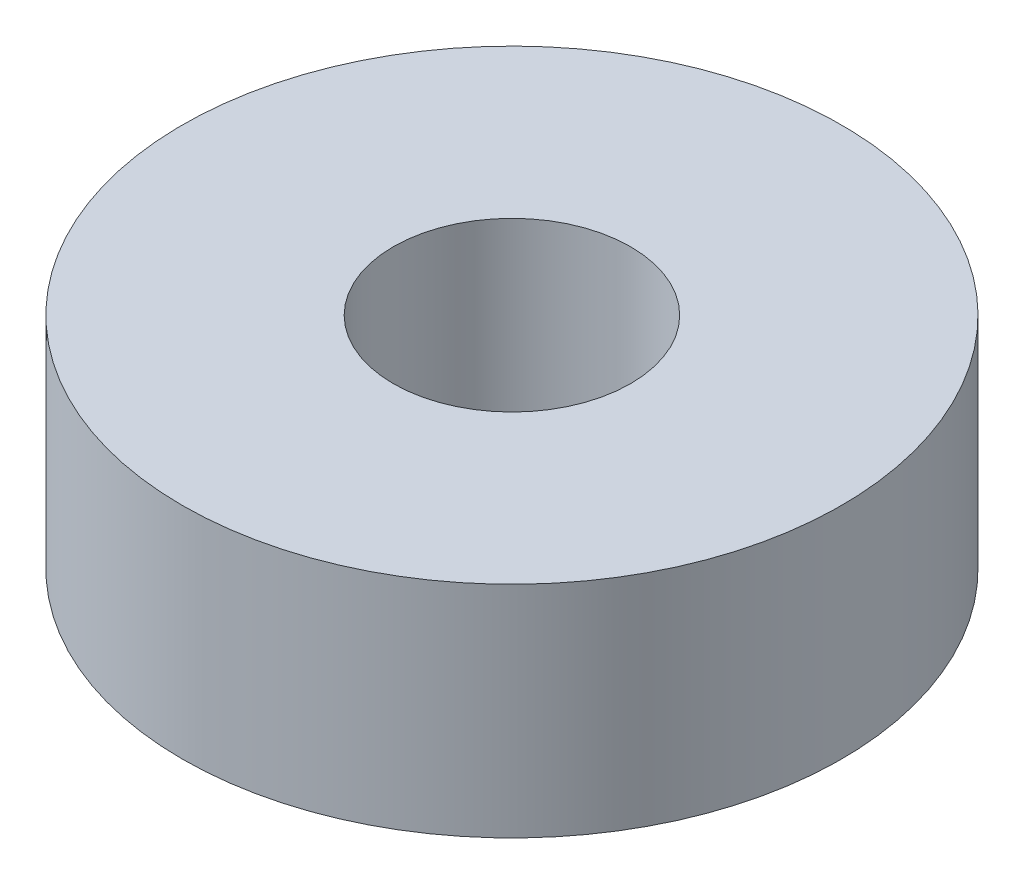
ISO-10303-21;
HEADER;
FILE_DESCRIPTION(('STEP AP214'),'2;1');
FILE_NAME('part.step','',(''),(''),'','','');
FILE_SCHEMA(('AUTOMOTIVE_DESIGN { 1 0 10303 214 1 1 1 1 }'));
ENDSEC;
DATA;
#1=APPLICATION_CONTEXT('core data for automotive mechanical design processes');
#2=APPLICATION_PROTOCOL_DEFINITION('international standard','automotive_design',2000,#1);
#3=PRODUCT_CONTEXT('',#1,'mechanical');
#4=PRODUCT('Part','Part','',(#3));
#5=PRODUCT_RELATED_PRODUCT_CATEGORY('part','',(#4));
#6=PRODUCT_DEFINITION_FORMATION('','',#4);
#7=PRODUCT_DEFINITION_CONTEXT('part definition',#1,'design');
#8=PRODUCT_DEFINITION('design','',#6,#7);
#9=PRODUCT_DEFINITION_SHAPE('','',#8);
#10=(LENGTH_UNIT() NAMED_UNIT(*) SI_UNIT(.MILLI.,.METRE.));
#11=(NAMED_UNIT(*) PLANE_ANGLE_UNIT() SI_UNIT($,.RADIAN.));
#12=(NAMED_UNIT(*) SI_UNIT($,.STERADIAN.) SOLID_ANGLE_UNIT());
#13=UNCERTAINTY_MEASURE_WITH_UNIT(LENGTH_MEASURE(1.E-05),#10,'distance_accuracy_value','');
#14=(GEOMETRIC_REPRESENTATION_CONTEXT(3) GLOBAL_UNCERTAINTY_ASSIGNED_CONTEXT((#13)) GLOBAL_UNIT_ASSIGNED_CONTEXT((#10,
#11,#12)) REPRESENTATION_CONTEXT('',''));
#15=CARTESIAN_POINT('',(0.,0.,0.));
#16=DIRECTION('',(0.,0.,1.));
#17=DIRECTION('',(1.,0.,0.));
#18=AXIS2_PLACEMENT_3D('',#15,#16,#17);
#19=CARTESIAN_POINT('',(0.,5.,0.));
#20=DIRECTION('',(0.,1.,0.));
#21=DIRECTION('',(0.,0.,1.));
#22=AXIS2_PLACEMENT_3D('',#19,#20,#21);
#23=PLANE('',#22);
#24=CARTESIAN_POINT('',(0.,5.,0.));
#25=DIRECTION('',(0.,1.,0.));
#26=DIRECTION('',(0.,0.,1.));
#27=AXIS2_PLACEMENT_3D('',#24,#25,#26);
#28=CIRCLE('',#27,7.5);
#29=CARTESIAN_POINT('',(0.,5.,7.5));
#30=VERTEX_POINT('',#29);
#31=EDGE_CURVE('E10',#30,#30,#28,.T.);
#32=ORIENTED_EDGE('',*,*,#31,.T.);
#33=EDGE_LOOP('',(#32));
#34=FACE_BOUND('',#33,.T.);
#35=CARTESIAN_POINT('',(0.,5.,0.));
#36=DIRECTION('',(0.,1.,0.));
#37=DIRECTION('',(0.,0.,1.));
#38=AXIS2_PLACEMENT_3D('',#35,#36,#37);
#39=CIRCLE('',#38,2.7);
#40=CARTESIAN_POINT('',(0.,5.,2.7));
#41=VERTEX_POINT('',#40);
#42=EDGE_CURVE('E50',#41,#41,#39,.T.);
#43=ORIENTED_EDGE('',*,*,#42,.F.);
#44=EDGE_LOOP('',(#43));
#45=FACE_BOUND('',#44,.T.);
#46=ADVANCED_FACE('F37',(#34,#45),#23,.T.);
#47=CARTESIAN_POINT('',(0.,0.,0.));
#48=DIRECTION('',(0.,1.,0.));
#49=DIRECTION('',(0.,0.,1.));
#50=AXIS2_PLACEMENT_3D('',#47,#48,#49);
#51=PLANE('',#50);
#52=CARTESIAN_POINT('',(0.,0.,0.));
#53=DIRECTION('',(0.,1.,0.));
#54=DIRECTION('',(0.,0.,1.));
#55=AXIS2_PLACEMENT_3D('',#52,#53,#54);
#56=CIRCLE('',#55,7.5);
#57=CARTESIAN_POINT('',(0.,0.,7.5));
#58=VERTEX_POINT('',#57);
#59=EDGE_CURVE('E41',#58,#58,#56,.T.);
#60=ORIENTED_EDGE('',*,*,#59,.F.);
#61=EDGE_LOOP('',(#60));
#62=FACE_BOUND('',#61,.T.);
#63=CARTESIAN_POINT('',(0.,0.,0.));
#64=DIRECTION('',(0.,1.,0.));
#65=DIRECTION('',(0.,0.,1.));
#66=AXIS2_PLACEMENT_3D('',#63,#64,#65);
#67=CIRCLE('',#66,2.7);
#68=CARTESIAN_POINT('',(0.,0.,2.7));
#69=VERTEX_POINT('',#68);
#70=EDGE_CURVE('E52',#69,#69,#67,.T.);
#71=ORIENTED_EDGE('',*,*,#70,.T.);
#72=EDGE_LOOP('',(#71));
#73=FACE_BOUND('',#72,.T.);
#74=ADVANCED_FACE('F64',(#62,#73),#51,.F.);
#75=CARTESIAN_POINT('',(0.,5.,0.));
#76=DIRECTION('',(0.,-1.,0.));
#77=DIRECTION('',(0.,0.,-1.));
#78=AXIS2_PLACEMENT_3D('',#75,#76,#77);
#79=CYLINDRICAL_SURFACE('',#78,7.5);
#80=ORIENTED_EDGE('',*,*,#31,.F.);
#81=EDGE_LOOP('',(#80));
#82=FACE_BOUND('',#81,.T.);
#83=ORIENTED_EDGE('',*,*,#59,.T.);
#84=EDGE_LOOP('',(#83));
#85=FACE_BOUND('',#84,.T.);
#86=ADVANCED_FACE('F39',(#82,#85),#79,.T.);
#87=CARTESIAN_POINT('',(0.,5.,0.));
#88=DIRECTION('',(0.,-1.,0.));
#89=DIRECTION('',(0.,0.,-1.));
#90=AXIS2_PLACEMENT_3D('',#87,#88,#89);
#91=CYLINDRICAL_SURFACE('',#90,2.7);
#92=ORIENTED_EDGE('',*,*,#42,.T.);
#93=EDGE_LOOP('',(#92));
#94=FACE_BOUND('',#93,.T.);
#95=ORIENTED_EDGE('',*,*,#70,.F.);
#96=EDGE_LOOP('',(#95));
#97=FACE_BOUND('',#96,.T.);
#98=ADVANCED_FACE('F60',(#94,#97),#91,.F.);
#99=CLOSED_SHELL('',(#46,#74,#86,#98));
#100=MANIFOLD_SOLID_BREP('B2',#99);
#101=ADVANCED_BREP_SHAPE_REPRESENTATION('',(#18,#100),#14);
#102=SHAPE_DEFINITION_REPRESENTATION(#9,#101);
ENDSEC;
END-ISO-10303-21;
